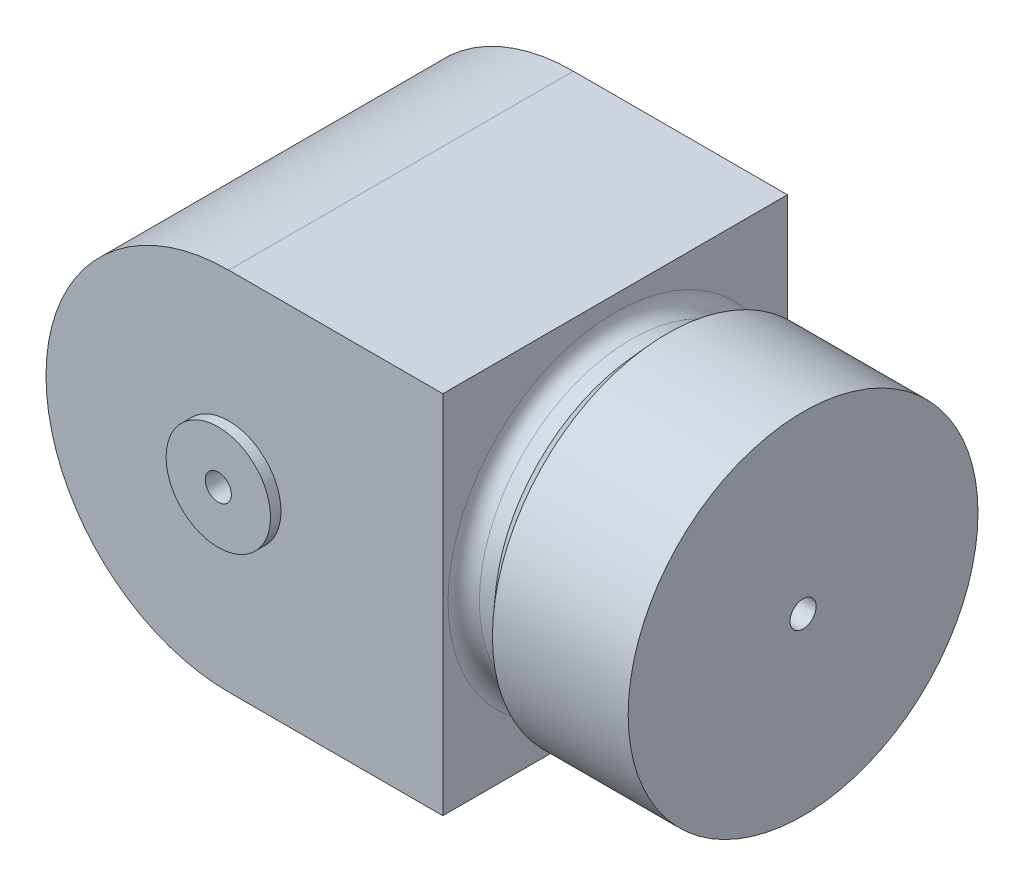
ISO-10303-21;
HEADER;
FILE_DESCRIPTION(('STEP AP214'),'2;1');
FILE_NAME('part.step','',(''),(''),'','','');
FILE_SCHEMA(('AUTOMOTIVE_DESIGN { 1 0 10303 214 1 1 1 1 }'));
ENDSEC;
DATA;
#1=APPLICATION_CONTEXT('core data for automotive mechanical design processes');
#2=APPLICATION_PROTOCOL_DEFINITION('international standard','automotive_design',2000,#1);
#3=PRODUCT_CONTEXT('',#1,'mechanical');
#4=PRODUCT('Part','Part','',(#3));
#5=PRODUCT_RELATED_PRODUCT_CATEGORY('part','',(#4));
#6=PRODUCT_DEFINITION_FORMATION('','',#4);
#7=PRODUCT_DEFINITION_CONTEXT('part definition',#1,'design');
#8=PRODUCT_DEFINITION('design','',#6,#7);
#9=PRODUCT_DEFINITION_SHAPE('','',#8);
#10=(LENGTH_UNIT() NAMED_UNIT(*) SI_UNIT(.MILLI.,.METRE.));
#11=(NAMED_UNIT(*) PLANE_ANGLE_UNIT() SI_UNIT($,.RADIAN.));
#12=(NAMED_UNIT(*) SI_UNIT($,.STERADIAN.) SOLID_ANGLE_UNIT());
#13=UNCERTAINTY_MEASURE_WITH_UNIT(LENGTH_MEASURE(1.E-05),#10,'distance_accuracy_value','');
#14=(GEOMETRIC_REPRESENTATION_CONTEXT(3) GLOBAL_UNCERTAINTY_ASSIGNED_CONTEXT((#13)) GLOBAL_UNIT_ASSIGNED_CONTEXT((#10,
#11,#12)) REPRESENTATION_CONTEXT('',''));
#15=CARTESIAN_POINT('',(0.,0.,0.));
#16=DIRECTION('',(0.,0.,1.));
#17=DIRECTION('',(1.,0.,0.));
#18=AXIS2_PLACEMENT_3D('',#15,#16,#17);
#19=CARTESIAN_POINT('',(0.,70.,0.));
#20=DIRECTION('',(0.,0.,-1.));
#21=DIRECTION('',(-1.,0.,0.));
#22=AXIS2_PLACEMENT_3D('',#19,#20,#21);
#23=PLANE('',#22);
#24=DIRECTION('',(1.,0.,0.));
#25=VECTOR('',#24,1.);
#26=CARTESIAN_POINT('',(0.,0.,0.));
#27=LINE('',#26,#25);
#28=CARTESIAN_POINT('',(35.,0.,0.));
#29=VERTEX_POINT('',#28);
#30=CARTESIAN_POINT('',(76.,0.,0.));
#31=VERTEX_POINT('',#30);
#32=EDGE_CURVE('E105',#29,#31,#27,.T.);
#33=ORIENTED_EDGE('',*,*,#32,.F.);
#34=CARTESIAN_POINT('',(35.,35.,0.));
#35=DIRECTION('',(0.,0.,-1.));
#36=DIRECTION('',(-1.,0.,0.));
#37=AXIS2_PLACEMENT_3D('',#34,#35,#36);
#38=CIRCLE('',#37,35.);
#39=CARTESIAN_POINT('',(35.,70.,0.));
#40=VERTEX_POINT('',#39);
#41=EDGE_CURVE('E92',#29,#40,#38,.T.);
#42=ORIENTED_EDGE('',*,*,#41,.T.);
#43=DIRECTION('',(-1.,0.,0.));
#44=VECTOR('',#43,1.);
#45=CARTESIAN_POINT('',(0.,70.,0.));
#46=LINE('',#45,#44);
#47=CARTESIAN_POINT('',(76.,70.,0.));
#48=VERTEX_POINT('',#47);
#49=EDGE_CURVE('E114',#48,#40,#46,.T.);
#50=ORIENTED_EDGE('',*,*,#49,.F.);
#51=DIRECTION('',(0.,1.,0.));
#52=VECTOR('',#51,1.);
#53=CARTESIAN_POINT('',(76.,0.,0.));
#54=LINE('',#53,#52);
#55=EDGE_CURVE('E112',#31,#48,#54,.T.);
#56=ORIENTED_EDGE('',*,*,#55,.F.);
#57=EDGE_LOOP('',(#33,#42,#50,#56));
#58=FACE_BOUND('',#57,.T.);
#59=CARTESIAN_POINT('',(35.,35.,0.));
#60=DIRECTION('',(0.,0.,-1.));
#61=DIRECTION('',(-1.,0.,0.));
#62=AXIS2_PLACEMENT_3D('',#59,#60,#61);
#63=CIRCLE('',#62,10.);
#64=CARTESIAN_POINT('',(25.,35.,0.));
#65=VERTEX_POINT('',#64);
#66=EDGE_CURVE('E243',#65,#65,#63,.T.);
#67=ORIENTED_EDGE('',*,*,#66,.F.);
#68=EDGE_LOOP('',(#67));
#69=FACE_BOUND('',#68,.T.);
#70=ADVANCED_FACE('F52',(#58,#69),#23,.T.);
#71=CARTESIAN_POINT('',(0.,70.,66.));
#72=DIRECTION('',(0.,0.,-1.));
#73=DIRECTION('',(-1.,0.,0.));
#74=AXIS2_PLACEMENT_3D('',#71,#72,#73);
#75=PLANE('',#74);
#76=CARTESIAN_POINT('',(35.,35.,66.));
#77=DIRECTION('',(0.,0.,-1.));
#78=DIRECTION('',(-1.,0.,0.));
#79=AXIS2_PLACEMENT_3D('',#76,#77,#78);
#80=CIRCLE('',#79,35.);
#81=CARTESIAN_POINT('',(35.,0.,66.));
#82=VERTEX_POINT('',#81);
#83=CARTESIAN_POINT('',(35.,70.,66.));
#84=VERTEX_POINT('',#83);
#85=EDGE_CURVE('E101',#82,#84,#80,.T.);
#86=ORIENTED_EDGE('',*,*,#85,.F.);
#87=DIRECTION('',(1.,0.,0.));
#88=VECTOR('',#87,1.);
#89=CARTESIAN_POINT('',(0.,0.,66.));
#90=LINE('',#89,#88);
#91=CARTESIAN_POINT('',(76.,0.,66.));
#92=VERTEX_POINT('',#91);
#93=EDGE_CURVE('E107',#82,#92,#90,.T.);
#94=ORIENTED_EDGE('',*,*,#93,.T.);
#95=DIRECTION('',(0.,1.,0.));
#96=VECTOR('',#95,1.);
#97=CARTESIAN_POINT('',(76.,0.,66.));
#98=LINE('',#97,#96);
#99=CARTESIAN_POINT('',(76.,70.,66.));
#100=VERTEX_POINT('',#99);
#101=EDGE_CURVE('E75',#92,#100,#98,.T.);
#102=ORIENTED_EDGE('',*,*,#101,.T.);
#103=DIRECTION('',(-1.,0.,0.));
#104=VECTOR('',#103,1.);
#105=CARTESIAN_POINT('',(0.,70.,66.));
#106=LINE('',#105,#104);
#107=EDGE_CURVE('E121',#100,#84,#106,.T.);
#108=ORIENTED_EDGE('',*,*,#107,.T.);
#109=EDGE_LOOP('',(#86,#94,#102,#108));
#110=FACE_BOUND('',#109,.T.);
#111=CARTESIAN_POINT('',(35.,35.,66.));
#112=DIRECTION('',(0.,0.,-1.));
#113=DIRECTION('',(-1.,0.,0.));
#114=AXIS2_PLACEMENT_3D('',#111,#112,#113);
#115=CIRCLE('',#114,10.);
#116=CARTESIAN_POINT('',(25.,35.,66.));
#117=VERTEX_POINT('',#116);
#118=EDGE_CURVE('E12',#117,#117,#115,.F.);
#119=ORIENTED_EDGE('',*,*,#118,.F.);
#120=EDGE_LOOP('',(#119));
#121=FACE_BOUND('',#120,.T.);
#122=ADVANCED_FACE('F170',(#110,#121),#75,.F.);
#123=CARTESIAN_POINT('',(76.,0.,66.));
#124=DIRECTION('',(-1.,0.,0.));
#125=DIRECTION('',(0.,0.,1.));
#126=AXIS2_PLACEMENT_3D('',#123,#124,#125);
#127=PLANE('',#126);
#128=CARTESIAN_POINT('',(76.,35.,33.));
#129=DIRECTION('',(-1.,0.,0.));
#130=DIRECTION('',(0.,0.,1.));
#131=AXIS2_PLACEMENT_3D('',#128,#129,#130);
#132=CIRCLE('',#131,32.);
#133=CARTESIAN_POINT('',(76.,35.,65.));
#134=VERTEX_POINT('',#133);
#135=EDGE_CURVE('E131',#134,#134,#132,.T.);
#136=ORIENTED_EDGE('',*,*,#135,.T.);
#137=EDGE_LOOP('',(#136));
#138=FACE_BOUND('',#137,.T.);
#139=ORIENTED_EDGE('',*,*,#55,.T.);
#140=DIRECTION('',(0.,0.,-1.));
#141=VECTOR('',#140,1.);
#142=CARTESIAN_POINT('',(76.,70.,66.));
#143=LINE('',#142,#141);
#144=EDGE_CURVE('E123',#100,#48,#143,.T.);
#145=ORIENTED_EDGE('',*,*,#144,.F.);
#146=ORIENTED_EDGE('',*,*,#101,.F.);
#147=DIRECTION('',(0.,0.,-1.));
#148=VECTOR('',#147,1.);
#149=CARTESIAN_POINT('',(76.,0.,66.));
#150=LINE('',#149,#148);
#151=EDGE_CURVE('E126',#92,#31,#150,.T.);
#152=ORIENTED_EDGE('',*,*,#151,.T.);
#153=EDGE_LOOP('',(#139,#145,#146,#152));
#154=FACE_BOUND('',#153,.T.);
#155=ADVANCED_FACE('F173',(#138,#154),#127,.F.);
#156=CARTESIAN_POINT('',(0.,70.,66.));
#157=DIRECTION('',(0.,-1.,0.));
#158=DIRECTION('',(0.,0.,-1.));
#159=AXIS2_PLACEMENT_3D('',#156,#157,#158);
#160=PLANE('',#159);
#161=DIRECTION('',(0.,0.,1.));
#162=VECTOR('',#161,1.);
#163=CARTESIAN_POINT('',(35.,70.,0.));
#164=LINE('',#163,#162);
#165=EDGE_CURVE('E67',#40,#84,#164,.T.);
#166=ORIENTED_EDGE('',*,*,#165,.T.);
#167=ORIENTED_EDGE('',*,*,#107,.F.);
#168=ORIENTED_EDGE('',*,*,#144,.T.);
#169=ORIENTED_EDGE('',*,*,#49,.T.);
#170=EDGE_LOOP('',(#166,#167,#168,#169));
#171=FACE_BOUND('',#170,.T.);
#172=ADVANCED_FACE('F169',(#171),#160,.F.);
#173=CARTESIAN_POINT('',(0.,0.,66.));
#174=DIRECTION('',(0.,1.,0.));
#175=DIRECTION('',(0.,0.,1.));
#176=AXIS2_PLACEMENT_3D('',#173,#174,#175);
#177=PLANE('',#176);
#178=ORIENTED_EDGE('',*,*,#93,.F.);
#179=DIRECTION('',(0.,0.,1.));
#180=VECTOR('',#179,1.);
#181=CARTESIAN_POINT('',(35.,0.,0.));
#182=LINE('',#181,#180);
#183=EDGE_CURVE('E95',#29,#82,#182,.T.);
#184=ORIENTED_EDGE('',*,*,#183,.F.);
#185=ORIENTED_EDGE('',*,*,#32,.T.);
#186=ORIENTED_EDGE('',*,*,#151,.F.);
#187=EDGE_LOOP('',(#178,#184,#185,#186));
#188=FACE_BOUND('',#187,.T.);
#189=ADVANCED_FACE('F54',(#188),#177,.F.);
#190=CARTESIAN_POINT('',(35.,35.,0.));
#191=DIRECTION('',(0.,0.,1.));
#192=DIRECTION('',(1.,0.,0.));
#193=AXIS2_PLACEMENT_3D('',#190,#191,#192);
#194=CYLINDRICAL_SURFACE('',#193,35.);
#195=ORIENTED_EDGE('',*,*,#85,.T.);
#196=ORIENTED_EDGE('',*,*,#165,.F.);
#197=ORIENTED_EDGE('',*,*,#41,.F.);
#198=ORIENTED_EDGE('',*,*,#183,.T.);
#199=EDGE_LOOP('',(#195,#196,#197,#198));
#200=FACE_BOUND('',#199,.T.);
#201=ADVANCED_FACE('F94',(#200),#194,.T.);
#202=CARTESIAN_POINT('',(35.,35.,0.));
#203=DIRECTION('',(0.,0.,1.));
#204=DIRECTION('',(1.,0.,0.));
#205=AXIS2_PLACEMENT_3D('',#202,#203,#204);
#206=CYLINDRICAL_SURFACE('',#205,2.5);
#207=CARTESIAN_POINT('',(35.,35.,68.));
#208=DIRECTION('',(0.,0.,1.));
#209=DIRECTION('',(1.,0.,0.));
#210=AXIS2_PLACEMENT_3D('',#207,#208,#209);
#211=CIRCLE('',#210,2.5);
#212=CARTESIAN_POINT('',(37.5,35.,68.));
#213=VERTEX_POINT('',#212);
#214=EDGE_CURVE('E238',#213,#213,#211,.T.);
#215=ORIENTED_EDGE('',*,*,#214,.T.);
#216=EDGE_LOOP('',(#215));
#217=FACE_BOUND('',#216,.T.);
#218=CARTESIAN_POINT('',(35.,35.,-2.));
#219=DIRECTION('',(0.,0.,-1.));
#220=DIRECTION('',(-1.,0.,0.));
#221=AXIS2_PLACEMENT_3D('',#218,#219,#220);
#222=CIRCLE('',#221,2.5);
#223=CARTESIAN_POINT('',(32.5,35.,-2.));
#224=VERTEX_POINT('',#223);
#225=EDGE_CURVE('E241',#224,#224,#222,.T.);
#226=ORIENTED_EDGE('',*,*,#225,.T.);
#227=EDGE_LOOP('',(#226));
#228=FACE_BOUND('',#227,.T.);
#229=ADVANCED_FACE('F219',(#217,#228),#206,.F.);
#230=CARTESIAN_POINT('',(82.,35.,33.));
#231=DIRECTION('',(-1.,0.,0.));
#232=DIRECTION('',(0.,0.,1.));
#233=AXIS2_PLACEMENT_3D('',#230,#231,#232);
#234=CYLINDRICAL_SURFACE('',#233,29.);
#235=CARTESIAN_POINT('',(79.,35.,33.));
#236=DIRECTION('',(-1.,0.,0.));
#237=DIRECTION('',(0.,0.,1.));
#238=AXIS2_PLACEMENT_3D('',#235,#236,#237);
#239=CIRCLE('',#238,29.);
#240=CARTESIAN_POINT('',(79.,35.,62.));
#241=VERTEX_POINT('',#240);
#242=EDGE_CURVE('E128',#241,#241,#239,.F.);
#243=ORIENTED_EDGE('',*,*,#242,.T.);
#244=EDGE_LOOP('',(#243));
#245=FACE_BOUND('',#244,.T.);
#246=CARTESIAN_POINT('',(82.,35.,33.));
#247=DIRECTION('',(1.,0.,0.));
#248=DIRECTION('',(0.,0.,-1.));
#249=AXIS2_PLACEMENT_3D('',#246,#247,#248);
#250=CIRCLE('',#249,29.);
#251=CARTESIAN_POINT('',(82.,35.,4.));
#252=VERTEX_POINT('',#251);
#253=EDGE_CURVE('E108',#252,#252,#250,.T.);
#254=ORIENTED_EDGE('',*,*,#253,.F.);
#255=EDGE_LOOP('',(#254));
#256=FACE_BOUND('',#255,.T.);
#257=ADVANCED_FACE('F213',(#245,#256),#234,.T.);
#258=CARTESIAN_POINT('',(79.,35.,33.));
#259=DIRECTION('',(-1.,0.,0.));
#260=DIRECTION('',(0.,0.,1.));
#261=AXIS2_PLACEMENT_3D('',#258,#259,#260);
#262=TOROIDAL_SURFACE('',#261,32.,3.);
#263=ORIENTED_EDGE('',*,*,#135,.F.);
#264=EDGE_LOOP('',(#263));
#265=FACE_BOUND('',#264,.T.);
#266=ORIENTED_EDGE('',*,*,#242,.F.);
#267=EDGE_LOOP('',(#266));
#268=FACE_BOUND('',#267,.T.);
#269=ADVANCED_FACE('F210',(#265,#268),#262,.F.);
#270=CARTESIAN_POINT('',(82.,35.,33.));
#271=DIRECTION('',(1.,0.,0.));
#272=DIRECTION('',(0.,0.,-1.));
#273=AXIS2_PLACEMENT_3D('',#270,#271,#272);
#274=PLANE('',#273);
#275=CARTESIAN_POINT('',(82.,35.,33.));
#276=DIRECTION('',(1.,0.,0.));
#277=DIRECTION('',(0.,0.,-1.));
#278=AXIS2_PLACEMENT_3D('',#275,#276,#277);
#279=CIRCLE('',#278,29.0575499406833);
#280=CARTESIAN_POINT('',(82.,35.,3.94245005931672));
#281=VERTEX_POINT('',#280);
#282=EDGE_CURVE('E60',#281,#281,#279,.F.);
#283=ORIENTED_EDGE('',*,*,#282,.T.);
#284=EDGE_LOOP('',(#283));
#285=FACE_BOUND('',#284,.T.);
#286=ORIENTED_EDGE('',*,*,#253,.T.);
#287=EDGE_LOOP('',(#286));
#288=FACE_BOUND('',#287,.T.);
#289=ADVANCED_FACE('F139',(#285,#288),#274,.F.);
#290=CARTESIAN_POINT('',(112.,35.,33.));
#291=DIRECTION('',(-1.,0.,0.));
#292=DIRECTION('',(0.,0.,1.));
#293=AXIS2_PLACEMENT_3D('',#290,#291,#292);
#294=CYLINDRICAL_SURFACE('',#293,33.5);
#295=CARTESIAN_POINT('',(86.,35.,33.));
#296=DIRECTION('',(1.,0.,0.));
#297=DIRECTION('',(0.,0.,-1.));
#298=AXIS2_PLACEMENT_3D('',#295,#296,#297);
#299=CIRCLE('',#298,33.5);
#300=CARTESIAN_POINT('',(86.,35.,-0.5));
#301=VERTEX_POINT('',#300);
#302=EDGE_CURVE('E134',#301,#301,#299,.T.);
#303=ORIENTED_EDGE('',*,*,#302,.T.);
#304=EDGE_LOOP('',(#303));
#305=FACE_BOUND('',#304,.T.);
#306=CARTESIAN_POINT('',(112.,35.,33.));
#307=DIRECTION('',(1.,0.,0.));
#308=DIRECTION('',(0.,0.,-1.));
#309=AXIS2_PLACEMENT_3D('',#306,#307,#308);
#310=CIRCLE('',#309,33.5);
#311=CARTESIAN_POINT('',(112.,35.,-0.5));
#312=VERTEX_POINT('',#311);
#313=EDGE_CURVE('E156',#312,#312,#310,.T.);
#314=ORIENTED_EDGE('',*,*,#313,.F.);
#315=EDGE_LOOP('',(#314));
#316=FACE_BOUND('',#315,.T.);
#317=ADVANCED_FACE('F150',(#305,#316),#294,.T.);
#318=CARTESIAN_POINT('',(112.,35.,33.));
#319=DIRECTION('',(1.,0.,0.));
#320=DIRECTION('',(0.,0.,-1.));
#321=AXIS2_PLACEMENT_3D('',#318,#319,#320);
#322=PLANE('',#321);
#323=CARTESIAN_POINT('',(112.,35.,33.));
#324=DIRECTION('',(1.,0.,0.));
#325=DIRECTION('',(0.,0.,-1.));
#326=AXIS2_PLACEMENT_3D('',#323,#324,#325);
#327=CIRCLE('',#326,2.5);
#328=CARTESIAN_POINT('',(112.,35.,30.5));
#329=VERTEX_POINT('',#328);
#330=EDGE_CURVE('E163',#329,#329,#327,.T.);
#331=ORIENTED_EDGE('',*,*,#330,.F.);
#332=EDGE_LOOP('',(#331));
#333=FACE_BOUND('',#332,.T.);
#334=ORIENTED_EDGE('',*,*,#313,.T.);
#335=EDGE_LOOP('',(#334));
#336=FACE_BOUND('',#335,.T.);
#337=ADVANCED_FACE('F146',(#333,#336),#322,.T.);
#338=CARTESIAN_POINT('',(86.,35.,33.));
#339=DIRECTION('',(1.,0.,0.));
#340=DIRECTION('',(0.,0.,-1.));
#341=AXIS2_PLACEMENT_3D('',#338,#339,#340);
#342=CONICAL_SURFACE('',#341,33.5,0.837758040957274);
#343=ORIENTED_EDGE('',*,*,#282,.F.);
#344=EDGE_LOOP('',(#343));
#345=FACE_BOUND('',#344,.T.);
#346=ORIENTED_EDGE('',*,*,#302,.F.);
#347=EDGE_LOOP('',(#346));
#348=FACE_BOUND('',#347,.T.);
#349=ADVANCED_FACE('F142',(#345,#348),#342,.T.);
#350=CARTESIAN_POINT('',(102.,35.,33.));
#351=DIRECTION('',(1.,0.,0.));
#352=DIRECTION('',(0.,0.,-1.));
#353=AXIS2_PLACEMENT_3D('',#350,#351,#352);
#354=CYLINDRICAL_SURFACE('',#353,2.5);
#355=CARTESIAN_POINT('',(102.,35.,33.));
#356=DIRECTION('',(1.,0.,0.));
#357=DIRECTION('',(0.,0.,-1.));
#358=AXIS2_PLACEMENT_3D('',#355,#356,#357);
#359=CIRCLE('',#358,2.5);
#360=CARTESIAN_POINT('',(102.,35.,30.5));
#361=VERTEX_POINT('',#360);
#362=EDGE_CURVE('E158',#361,#361,#359,.T.);
#363=ORIENTED_EDGE('',*,*,#362,.F.);
#364=EDGE_LOOP('',(#363));
#365=FACE_BOUND('',#364,.T.);
#366=ORIENTED_EDGE('',*,*,#330,.T.);
#367=EDGE_LOOP('',(#366));
#368=FACE_BOUND('',#367,.T.);
#369=ADVANCED_FACE('F145',(#365,#368),#354,.F.);
#370=CARTESIAN_POINT('',(102.,35.,33.));
#371=DIRECTION('',(1.,0.,0.));
#372=DIRECTION('',(0.,0.,-1.));
#373=AXIS2_PLACEMENT_3D('',#370,#371,#372);
#374=PLANE('',#373);
#375=ORIENTED_EDGE('',*,*,#362,.T.);
#376=EDGE_LOOP('',(#375));
#377=FACE_BOUND('',#376,.T.);
#378=ADVANCED_FACE('F190',(#377),#374,.T.);
#379=CARTESIAN_POINT('',(35.,35.,68.));
#380=DIRECTION('',(0.,0.,1.));
#381=DIRECTION('',(1.,0.,0.));
#382=AXIS2_PLACEMENT_3D('',#379,#380,#381);
#383=PLANE('',#382);
#384=CARTESIAN_POINT('',(35.,35.,68.));
#385=DIRECTION('',(0.,0.,1.));
#386=DIRECTION('',(1.,0.,0.));
#387=AXIS2_PLACEMENT_3D('',#384,#385,#386);
#388=CIRCLE('',#387,10.);
#389=CARTESIAN_POINT('',(45.,35.,68.));
#390=VERTEX_POINT('',#389);
#391=EDGE_CURVE('E252',#390,#390,#388,.T.);
#392=ORIENTED_EDGE('',*,*,#391,.T.);
#393=EDGE_LOOP('',(#392));
#394=FACE_BOUND('',#393,.T.);
#395=ORIENTED_EDGE('',*,*,#214,.F.);
#396=EDGE_LOOP('',(#395));
#397=FACE_BOUND('',#396,.T.);
#398=ADVANCED_FACE('F180',(#394,#397),#383,.T.);
#399=CARTESIAN_POINT('',(35.,35.,68.));
#400=DIRECTION('',(0.,0.,-1.));
#401=DIRECTION('',(-1.,0.,0.));
#402=AXIS2_PLACEMENT_3D('',#399,#400,#401);
#403=CYLINDRICAL_SURFACE('',#402,10.);
#404=ORIENTED_EDGE('',*,*,#391,.F.);
#405=EDGE_LOOP('',(#404));
#406=FACE_BOUND('',#405,.T.);
#407=ORIENTED_EDGE('',*,*,#118,.T.);
#408=EDGE_LOOP('',(#407));
#409=FACE_BOUND('',#408,.T.);
#410=ADVANCED_FACE('F177',(#406,#409),#403,.T.);
#411=CARTESIAN_POINT('',(35.,35.,-2.));
#412=DIRECTION('',(0.,0.,-1.));
#413=DIRECTION('',(-1.,0.,0.));
#414=AXIS2_PLACEMENT_3D('',#411,#412,#413);
#415=PLANE('',#414);
#416=CARTESIAN_POINT('',(35.,35.,-2.));
#417=DIRECTION('',(0.,0.,-1.));
#418=DIRECTION('',(-1.,0.,0.));
#419=AXIS2_PLACEMENT_3D('',#416,#417,#418);
#420=CIRCLE('',#419,10.);
#421=CARTESIAN_POINT('',(25.,35.,-2.));
#422=VERTEX_POINT('',#421);
#423=EDGE_CURVE('E246',#422,#422,#420,.T.);
#424=ORIENTED_EDGE('',*,*,#423,.T.);
#425=EDGE_LOOP('',(#424));
#426=FACE_BOUND('',#425,.T.);
#427=ORIENTED_EDGE('',*,*,#225,.F.);
#428=EDGE_LOOP('',(#427));
#429=FACE_BOUND('',#428,.T.);
#430=ADVANCED_FACE('F179',(#426,#429),#415,.T.);
#431=CARTESIAN_POINT('',(35.,35.,-2.));
#432=DIRECTION('',(0.,0.,1.));
#433=DIRECTION('',(1.,0.,0.));
#434=AXIS2_PLACEMENT_3D('',#431,#432,#433);
#435=CYLINDRICAL_SURFACE('',#434,10.);
#436=ORIENTED_EDGE('',*,*,#423,.F.);
#437=EDGE_LOOP('',(#436));
#438=FACE_BOUND('',#437,.T.);
#439=ORIENTED_EDGE('',*,*,#66,.T.);
#440=EDGE_LOOP('',(#439));
#441=FACE_BOUND('',#440,.T.);
#442=ADVANCED_FACE('F187',(#438,#441),#435,.T.);
#443=CLOSED_SHELL('',(#70,#122,#155,#172,#189,#201,#229,#257,#269,#289,#317,#337,#349,#369,#378,
#398,#410,#430,#442));
#444=MANIFOLD_SOLID_BREP('B2',#443);
#445=ADVANCED_BREP_SHAPE_REPRESENTATION('',(#18,#444),#14);
#446=SHAPE_DEFINITION_REPRESENTATION(#9,#445);
ENDSEC;
END-ISO-10303-21;
